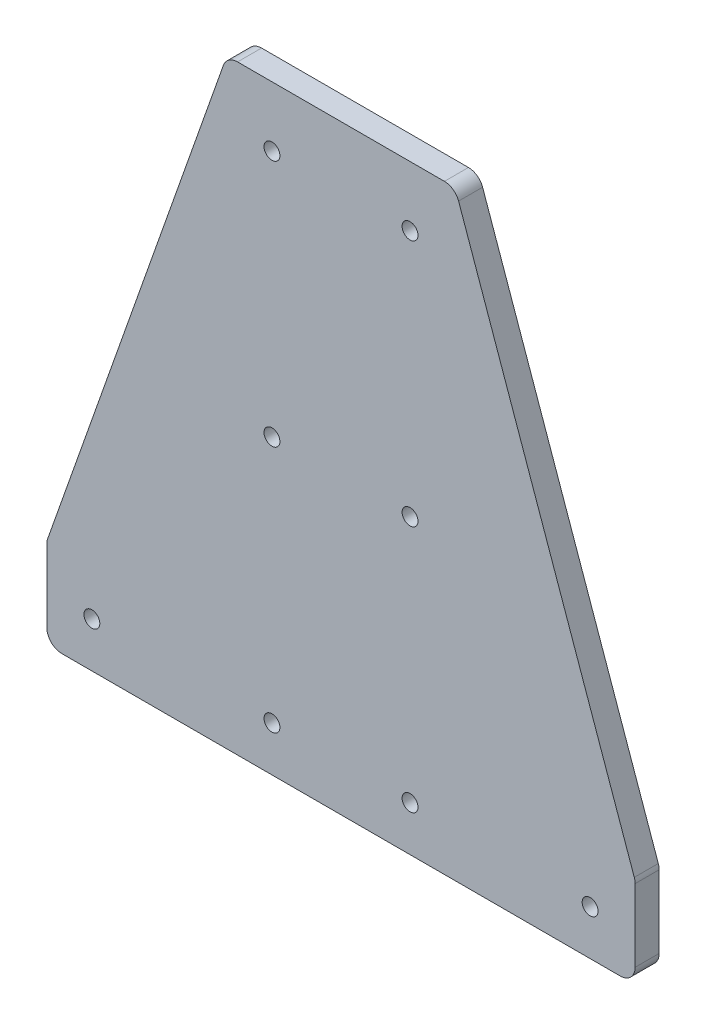
ISO-10303-21;
HEADER;
FILE_DESCRIPTION(('STEP AP214'),'2;1');
FILE_NAME('part.step','',(''),(''),'','','');
FILE_SCHEMA(('AUTOMOTIVE_DESIGN { 1 0 10303 214 1 1 1 1 }'));
ENDSEC;
DATA;
#1=APPLICATION_CONTEXT('core data for automotive mechanical design processes');
#2=APPLICATION_PROTOCOL_DEFINITION('international standard','automotive_design',2000,#1);
#3=PRODUCT_CONTEXT('',#1,'mechanical');
#4=PRODUCT('Part','Part','',(#3));
#5=PRODUCT_RELATED_PRODUCT_CATEGORY('part','',(#4));
#6=PRODUCT_DEFINITION_FORMATION('','',#4);
#7=PRODUCT_DEFINITION_CONTEXT('part definition',#1,'design');
#8=PRODUCT_DEFINITION('design','',#6,#7);
#9=PRODUCT_DEFINITION_SHAPE('','',#8);
#10=(LENGTH_UNIT() NAMED_UNIT(*) SI_UNIT(.MILLI.,.METRE.));
#11=(NAMED_UNIT(*) PLANE_ANGLE_UNIT() SI_UNIT($,.RADIAN.));
#12=(NAMED_UNIT(*) SI_UNIT($,.STERADIAN.) SOLID_ANGLE_UNIT());
#13=UNCERTAINTY_MEASURE_WITH_UNIT(LENGTH_MEASURE(1.E-05),#10,'distance_accuracy_value','');
#14=(GEOMETRIC_REPRESENTATION_CONTEXT(3) GLOBAL_UNCERTAINTY_ASSIGNED_CONTEXT((#13)) GLOBAL_UNIT_ASSIGNED_CONTEXT((#10,
#11,#12)) REPRESENTATION_CONTEXT('',''));
#15=CARTESIAN_POINT('',(0.,0.,0.));
#16=DIRECTION('',(0.,0.,1.));
#17=DIRECTION('',(1.,0.,0.));
#18=AXIS2_PLACEMENT_3D('',#15,#16,#17);
#19=CARTESIAN_POINT('',(-98.,0.,8.));
#20=DIRECTION('',(1.,0.,0.));
#21=DIRECTION('',(0.,0.,-1.));
#22=AXIS2_PLACEMENT_3D('',#19,#20,#21);
#23=PLANE('',#22);
#24=DIRECTION('',(0.,-1.,0.));
#25=VECTOR('',#24,1.);
#26=CARTESIAN_POINT('',(-98.,0.,0.));
#27=LINE('',#26,#25);
#28=CARTESIAN_POINT('',(-98.,-0.856463647766613,0.));
#29=VERTEX_POINT('',#28);
#30=CARTESIAN_POINT('',(-98.,-25.,0.));
#31=VERTEX_POINT('',#30);
#32=EDGE_CURVE('E200',#29,#31,#27,.T.);
#33=ORIENTED_EDGE('',*,*,#32,.T.);
#34=DIRECTION('',(0.,0.,-1.));
#35=VECTOR('',#34,1.);
#36=CARTESIAN_POINT('',(-98.,-25.,8.));
#37=LINE('',#36,#35);
#38=CARTESIAN_POINT('',(-98.,-25.,8.));
#39=VERTEX_POINT('',#38);
#40=EDGE_CURVE('E193',#31,#39,#37,.F.);
#41=ORIENTED_EDGE('',*,*,#40,.T.);
#42=DIRECTION('',(0.,-1.,0.));
#43=VECTOR('',#42,1.);
#44=CARTESIAN_POINT('',(-98.,0.,8.));
#45=LINE('',#44,#43);
#46=CARTESIAN_POINT('',(-98.,-0.856463647766613,8.));
#47=VERTEX_POINT('',#46);
#48=EDGE_CURVE('E150',#47,#39,#45,.T.);
#49=ORIENTED_EDGE('',*,*,#48,.F.);
#50=DIRECTION('',(0.,0.,-1.));
#51=VECTOR('',#50,1.);
#52=CARTESIAN_POINT('',(-98.,-0.856463647766613,8.));
#53=LINE('',#52,#51);
#54=EDGE_CURVE('E190',#47,#29,#53,.T.);
#55=ORIENTED_EDGE('',*,*,#54,.T.);
#56=EDGE_LOOP('',(#33,#41,#49,#55));
#57=FACE_BOUND('',#56,.T.);
#58=ADVANCED_FACE('F33',(#57),#23,.F.);
#59=CARTESIAN_POINT('',(-98.,-30.,8.));
#60=DIRECTION('',(0.,1.,0.));
#61=DIRECTION('',(0.,0.,1.));
#62=AXIS2_PLACEMENT_3D('',#59,#60,#61);
#63=PLANE('',#62);
#64=DIRECTION('',(1.,0.,0.));
#65=VECTOR('',#64,1.);
#66=CARTESIAN_POINT('',(-98.,-30.,0.));
#67=LINE('',#66,#65);
#68=CARTESIAN_POINT('',(-93.,-30.,0.));
#69=VERTEX_POINT('',#68);
#70=CARTESIAN_POINT('',(93.,-30.,0.));
#71=VERTEX_POINT('',#70);
#72=EDGE_CURVE('E227',#69,#71,#67,.T.);
#73=ORIENTED_EDGE('',*,*,#72,.T.);
#74=DIRECTION('',(0.,0.,-1.));
#75=VECTOR('',#74,1.);
#76=CARTESIAN_POINT('',(93.,-30.,8.));
#77=LINE('',#76,#75);
#78=CARTESIAN_POINT('',(93.,-30.,8.));
#79=VERTEX_POINT('',#78);
#80=EDGE_CURVE('E188',#71,#79,#77,.F.);
#81=ORIENTED_EDGE('',*,*,#80,.T.);
#82=DIRECTION('',(1.,0.,0.));
#83=VECTOR('',#82,1.);
#84=CARTESIAN_POINT('',(-98.,-30.,8.));
#85=LINE('',#84,#83);
#86=CARTESIAN_POINT('',(-93.,-30.,8.));
#87=VERTEX_POINT('',#86);
#88=EDGE_CURVE('E210',#87,#79,#85,.T.);
#89=ORIENTED_EDGE('',*,*,#88,.F.);
#90=DIRECTION('',(0.,0.,-1.));
#91=VECTOR('',#90,1.);
#92=CARTESIAN_POINT('',(-93.,-30.,8.));
#93=LINE('',#92,#91);
#94=EDGE_CURVE('E185',#87,#69,#93,.T.);
#95=ORIENTED_EDGE('',*,*,#94,.T.);
#96=EDGE_LOOP('',(#73,#81,#89,#95));
#97=FACE_BOUND('',#96,.T.);
#98=ADVANCED_FACE('F251',(#97),#63,.F.);
#99=CARTESIAN_POINT('',(98.,-30.,8.));
#100=DIRECTION('',(-1.,0.,0.));
#101=DIRECTION('',(0.,0.,1.));
#102=AXIS2_PLACEMENT_3D('',#99,#100,#101);
#103=PLANE('',#102);
#104=DIRECTION('',(0.,1.,0.));
#105=VECTOR('',#104,1.);
#106=CARTESIAN_POINT('',(98.,-30.,0.));
#107=LINE('',#106,#105);
#108=CARTESIAN_POINT('',(98.,-25.,0.));
#109=VERTEX_POINT('',#108);
#110=CARTESIAN_POINT('',(98.,-0.856463647766592,0.));
#111=VERTEX_POINT('',#110);
#112=EDGE_CURVE('E152',#109,#111,#107,.T.);
#113=ORIENTED_EDGE('',*,*,#112,.T.);
#114=DIRECTION('',(0.,0.,-1.));
#115=VECTOR('',#114,1.);
#116=CARTESIAN_POINT('',(98.,-0.856463647766592,8.));
#117=LINE('',#116,#115);
#118=CARTESIAN_POINT('',(98.,-0.856463647766592,8.));
#119=VERTEX_POINT('',#118);
#120=EDGE_CURVE('E183',#111,#119,#117,.F.);
#121=ORIENTED_EDGE('',*,*,#120,.T.);
#122=DIRECTION('',(0.,1.,0.));
#123=VECTOR('',#122,1.);
#124=CARTESIAN_POINT('',(98.,-30.,8.));
#125=LINE('',#124,#123);
#126=CARTESIAN_POINT('',(98.,-25.,8.));
#127=VERTEX_POINT('',#126);
#128=EDGE_CURVE('E213',#127,#119,#125,.T.);
#129=ORIENTED_EDGE('',*,*,#128,.F.);
#130=DIRECTION('',(0.,0.,-1.));
#131=VECTOR('',#130,1.);
#132=CARTESIAN_POINT('',(98.,-25.,8.));
#133=LINE('',#132,#131);
#134=EDGE_CURVE('E180',#127,#109,#133,.T.);
#135=ORIENTED_EDGE('',*,*,#134,.T.);
#136=EDGE_LOOP('',(#113,#121,#129,#135));
#137=FACE_BOUND('',#136,.T.);
#138=ADVANCED_FACE('F233',(#137),#103,.F.);
#139=CARTESIAN_POINT('',(98.,0.,8.));
#140=DIRECTION('',(-0.94299033358289,-0.332820117735137,0.));
#141=DIRECTION('',(0.332820117735137,-0.94299033358289,0.));
#142=AXIS2_PLACEMENT_3D('',#139,#140,#141);
#143=PLANE('',#142);
#144=DIRECTION('',(-0.332820117735137,0.94299033358289,0.));
#145=VECTOR('',#144,1.);
#146=CARTESIAN_POINT('',(98.,0.,0.));
#147=LINE('',#146,#145);
#148=CARTESIAN_POINT('',(97.7149516679144,0.807636940909095,0.));
#149=VERTEX_POINT('',#148);
#150=CARTESIAN_POINT('',(39.1773762628204,166.664100588676,0.));
#151=VERTEX_POINT('',#150);
#152=EDGE_CURVE('E148',#149,#151,#147,.T.);
#153=ORIENTED_EDGE('',*,*,#152,.T.);
#154=DIRECTION('',(0.,0.,-1.));
#155=VECTOR('',#154,1.);
#156=CARTESIAN_POINT('',(39.1773762628203,166.664100588676,8.));
#157=LINE('',#156,#155);
#158=CARTESIAN_POINT('',(39.1773762628204,166.664100588676,8.));
#159=VERTEX_POINT('',#158);
#160=EDGE_CURVE('E127',#151,#159,#157,.F.);
#161=ORIENTED_EDGE('',*,*,#160,.T.);
#162=DIRECTION('',(-0.332820117735137,0.94299033358289,0.));
#163=VECTOR('',#162,1.);
#164=CARTESIAN_POINT('',(98.,0.,8.));
#165=LINE('',#164,#163);
#166=CARTESIAN_POINT('',(97.7149516679144,0.807636940909095,8.));
#167=VERTEX_POINT('',#166);
#168=EDGE_CURVE('E221',#167,#159,#165,.T.);
#169=ORIENTED_EDGE('',*,*,#168,.F.);
#170=DIRECTION('',(0.,0.,-1.));
#171=VECTOR('',#170,1.);
#172=CARTESIAN_POINT('',(97.7149516679144,0.807636940909095,8.));
#173=LINE('',#172,#171);
#174=EDGE_CURVE('E132',#167,#149,#173,.T.);
#175=ORIENTED_EDGE('',*,*,#174,.T.);
#176=EDGE_LOOP('',(#153,#161,#169,#175));
#177=FACE_BOUND('',#176,.T.);
#178=ADVANCED_FACE('F243',(#177),#143,.F.);
#179=CARTESIAN_POINT('',(38.,170.,8.));
#180=DIRECTION('',(0.,-1.,0.));
#181=DIRECTION('',(0.,0.,-1.));
#182=AXIS2_PLACEMENT_3D('',#179,#180,#181);
#183=PLANE('',#182);
#184=DIRECTION('',(-1.,0.,0.));
#185=VECTOR('',#184,1.);
#186=CARTESIAN_POINT('',(38.,170.,8.));
#187=LINE('',#186,#185);
#188=CARTESIAN_POINT('',(34.4624245949059,170.,8.));
#189=VERTEX_POINT('',#188);
#190=CARTESIAN_POINT('',(-34.4624245949059,170.,8.));
#191=VERTEX_POINT('',#190);
#192=EDGE_CURVE('E141',#189,#191,#187,.T.);
#193=ORIENTED_EDGE('',*,*,#192,.F.);
#194=DIRECTION('',(0.,0.,-1.));
#195=VECTOR('',#194,1.);
#196=CARTESIAN_POINT('',(34.4624245949059,170.,8.));
#197=LINE('',#196,#195);
#198=CARTESIAN_POINT('',(34.4624245949059,170.,0.));
#199=VERTEX_POINT('',#198);
#200=EDGE_CURVE('E126',#189,#199,#197,.T.);
#201=ORIENTED_EDGE('',*,*,#200,.T.);
#202=DIRECTION('',(-1.,0.,0.));
#203=VECTOR('',#202,1.);
#204=CARTESIAN_POINT('',(38.,170.,0.));
#205=LINE('',#204,#203);
#206=CARTESIAN_POINT('',(-34.4624245949059,170.,0.));
#207=VERTEX_POINT('',#206);
#208=EDGE_CURVE('E139',#199,#207,#205,.T.);
#209=ORIENTED_EDGE('',*,*,#208,.T.);
#210=DIRECTION('',(0.,0.,-1.));
#211=VECTOR('',#210,1.);
#212=CARTESIAN_POINT('',(-34.4624245949059,170.,8.));
#213=LINE('',#212,#211);
#214=EDGE_CURVE('E143',#207,#191,#213,.F.);
#215=ORIENTED_EDGE('',*,*,#214,.T.);
#216=EDGE_LOOP('',(#193,#201,#209,#215));
#217=FACE_BOUND('',#216,.T.);
#218=ADVANCED_FACE('F138',(#217),#183,.F.);
#219=CARTESIAN_POINT('',(-38.,170.,8.));
#220=DIRECTION('',(0.94299033358289,-0.332820117735138,0.));
#221=DIRECTION('',(0.332820117735138,0.94299033358289,0.));
#222=AXIS2_PLACEMENT_3D('',#219,#220,#221);
#223=PLANE('',#222);
#224=DIRECTION('',(-0.332820117735138,-0.94299033358289,0.));
#225=VECTOR('',#224,1.);
#226=CARTESIAN_POINT('',(-38.,170.,0.));
#227=LINE('',#226,#225);
#228=CARTESIAN_POINT('',(-39.1773762628203,166.664100588676,0.));
#229=VERTEX_POINT('',#228);
#230=CARTESIAN_POINT('',(-97.7149516679144,0.807636940909046,0.));
#231=VERTEX_POINT('',#230);
#232=EDGE_CURVE('E147',#229,#231,#227,.T.);
#233=ORIENTED_EDGE('',*,*,#232,.T.);
#234=DIRECTION('',(0.,0.,-1.));
#235=VECTOR('',#234,1.);
#236=CARTESIAN_POINT('',(-97.7149516679144,0.807636940909046,8.));
#237=LINE('',#236,#235);
#238=CARTESIAN_POINT('',(-97.7149516679144,0.807636940909046,8.));
#239=VERTEX_POINT('',#238);
#240=EDGE_CURVE('E11',#231,#239,#237,.F.);
#241=ORIENTED_EDGE('',*,*,#240,.T.);
#242=DIRECTION('',(-0.332820117735138,-0.94299033358289,0.));
#243=VECTOR('',#242,1.);
#244=CARTESIAN_POINT('',(-38.,170.,8.));
#245=LINE('',#244,#243);
#246=CARTESIAN_POINT('',(-39.1773762628203,166.664100588676,8.));
#247=VERTEX_POINT('',#246);
#248=EDGE_CURVE('E156',#247,#239,#245,.T.);
#249=ORIENTED_EDGE('',*,*,#248,.F.);
#250=DIRECTION('',(0.,0.,-1.));
#251=VECTOR('',#250,1.);
#252=CARTESIAN_POINT('',(-39.1773762628203,166.664100588676,8.));
#253=LINE('',#252,#251);
#254=EDGE_CURVE('E41',#247,#229,#253,.T.);
#255=ORIENTED_EDGE('',*,*,#254,.T.);
#256=EDGE_LOOP('',(#233,#241,#249,#255));
#257=FACE_BOUND('',#256,.T.);
#258=ADVANCED_FACE('F196',(#257),#223,.F.);
#259=CARTESIAN_POINT('',(0.,0.,8.));
#260=DIRECTION('',(0.,0.,1.));
#261=DIRECTION('',(1.,0.,0.));
#262=AXIS2_PLACEMENT_3D('',#259,#260,#261);
#263=PLANE('',#262);
#264=CARTESIAN_POINT('',(-23.,150.,8.));
#265=DIRECTION('',(0.,0.,1.));
#266=DIRECTION('',(1.,0.,0.));
#267=AXIS2_PLACEMENT_3D('',#264,#265,#266);
#268=CIRCLE('',#267,2.65);
#269=CARTESIAN_POINT('',(-20.35,150.,8.));
#270=VERTEX_POINT('',#269);
#271=EDGE_CURVE('E489',#270,#270,#268,.T.);
#272=ORIENTED_EDGE('',*,*,#271,.F.);
#273=EDGE_LOOP('',(#272));
#274=FACE_BOUND('',#273,.T.);
#275=CARTESIAN_POINT('',(-23.,67.5,8.));
#276=DIRECTION('',(0.,0.,1.));
#277=DIRECTION('',(1.,0.,0.));
#278=AXIS2_PLACEMENT_3D('',#275,#276,#277);
#279=CIRCLE('',#278,2.65);
#280=CARTESIAN_POINT('',(-20.35,67.5,8.));
#281=VERTEX_POINT('',#280);
#282=EDGE_CURVE('E483',#281,#281,#279,.T.);
#283=ORIENTED_EDGE('',*,*,#282,.F.);
#284=EDGE_LOOP('',(#283));
#285=FACE_BOUND('',#284,.T.);
#286=CARTESIAN_POINT('',(-23.,-15.,8.));
#287=DIRECTION('',(0.,0.,1.));
#288=DIRECTION('',(1.,0.,0.));
#289=AXIS2_PLACEMENT_3D('',#286,#287,#288);
#290=CIRCLE('',#289,2.65);
#291=CARTESIAN_POINT('',(-20.35,-15.,8.));
#292=VERTEX_POINT('',#291);
#293=EDGE_CURVE('E477',#292,#292,#290,.T.);
#294=ORIENTED_EDGE('',*,*,#293,.F.);
#295=EDGE_LOOP('',(#294));
#296=FACE_BOUND('',#295,.T.);
#297=CARTESIAN_POINT('',(23.,-15.,8.));
#298=DIRECTION('',(0.,0.,1.));
#299=DIRECTION('',(1.,0.,0.));
#300=AXIS2_PLACEMENT_3D('',#297,#298,#299);
#301=CIRCLE('',#300,2.65);
#302=CARTESIAN_POINT('',(25.65,-15.,8.));
#303=VERTEX_POINT('',#302);
#304=EDGE_CURVE('E471',#303,#303,#301,.T.);
#305=ORIENTED_EDGE('',*,*,#304,.F.);
#306=EDGE_LOOP('',(#305));
#307=FACE_BOUND('',#306,.T.);
#308=CARTESIAN_POINT('',(23.,150.,8.));
#309=DIRECTION('',(0.,0.,1.));
#310=DIRECTION('',(1.,0.,0.));
#311=AXIS2_PLACEMENT_3D('',#308,#309,#310);
#312=CIRCLE('',#311,2.65);
#313=CARTESIAN_POINT('',(25.65,150.,8.));
#314=VERTEX_POINT('',#313);
#315=EDGE_CURVE('E465',#314,#314,#312,.T.);
#316=ORIENTED_EDGE('',*,*,#315,.F.);
#317=EDGE_LOOP('',(#316));
#318=FACE_BOUND('',#317,.T.);
#319=CARTESIAN_POINT('',(23.,67.5,8.));
#320=DIRECTION('',(0.,0.,1.));
#321=DIRECTION('',(1.,0.,0.));
#322=AXIS2_PLACEMENT_3D('',#319,#320,#321);
#323=CIRCLE('',#322,2.65);
#324=CARTESIAN_POINT('',(25.65,67.5,8.));
#325=VERTEX_POINT('',#324);
#326=EDGE_CURVE('E459',#325,#325,#323,.T.);
#327=ORIENTED_EDGE('',*,*,#326,.F.);
#328=EDGE_LOOP('',(#327));
#329=FACE_BOUND('',#328,.T.);
#330=CARTESIAN_POINT('',(-83.,-15.,8.));
#331=DIRECTION('',(0.,0.,1.));
#332=DIRECTION('',(1.,0.,0.));
#333=AXIS2_PLACEMENT_3D('',#330,#331,#332);
#334=CIRCLE('',#333,2.65);
#335=CARTESIAN_POINT('',(-80.35,-15.,8.));
#336=VERTEX_POINT('',#335);
#337=EDGE_CURVE('E451',#336,#336,#334,.T.);
#338=ORIENTED_EDGE('',*,*,#337,.F.);
#339=EDGE_LOOP('',(#338));
#340=FACE_BOUND('',#339,.T.);
#341=CARTESIAN_POINT('',(83.,-15.,8.));
#342=DIRECTION('',(0.,0.,1.));
#343=DIRECTION('',(1.,0.,0.));
#344=AXIS2_PLACEMENT_3D('',#341,#342,#343);
#345=CIRCLE('',#344,2.65);
#346=CARTESIAN_POINT('',(85.65,-15.,8.));
#347=VERTEX_POINT('',#346);
#348=EDGE_CURVE('E447',#347,#347,#345,.T.);
#349=ORIENTED_EDGE('',*,*,#348,.F.);
#350=EDGE_LOOP('',(#349));
#351=FACE_BOUND('',#350,.T.);
#352=ORIENTED_EDGE('',*,*,#168,.T.);
#353=CARTESIAN_POINT('',(34.4624245949059,165.,8.));
#354=DIRECTION('',(0.,0.,1.));
#355=DIRECTION('',(1.,0.,0.));
#356=AXIS2_PLACEMENT_3D('',#353,#354,#355);
#357=CIRCLE('',#356,5.);
#358=EDGE_CURVE('E178',#159,#189,#357,.T.);
#359=ORIENTED_EDGE('',*,*,#358,.T.);
#360=ORIENTED_EDGE('',*,*,#192,.T.);
#361=CARTESIAN_POINT('',(-34.4624245949059,165.,8.));
#362=DIRECTION('',(0.,0.,1.));
#363=DIRECTION('',(1.,0.,0.));
#364=AXIS2_PLACEMENT_3D('',#361,#362,#363);
#365=CIRCLE('',#364,5.);
#366=EDGE_CURVE('E53',#191,#247,#365,.T.);
#367=ORIENTED_EDGE('',*,*,#366,.T.);
#368=ORIENTED_EDGE('',*,*,#248,.T.);
#369=CARTESIAN_POINT('',(-93.,-0.856463647766613,8.));
#370=DIRECTION('',(0.,0.,1.));
#371=DIRECTION('',(1.,0.,0.));
#372=AXIS2_PLACEMENT_3D('',#369,#370,#371);
#373=CIRCLE('',#372,5.);
#374=EDGE_CURVE('E170',#239,#47,#373,.T.);
#375=ORIENTED_EDGE('',*,*,#374,.T.);
#376=ORIENTED_EDGE('',*,*,#48,.T.);
#377=CARTESIAN_POINT('',(-93.,-25.,8.));
#378=DIRECTION('',(0.,0.,1.));
#379=DIRECTION('',(1.,0.,0.));
#380=AXIS2_PLACEMENT_3D('',#377,#378,#379);
#381=CIRCLE('',#380,5.);
#382=EDGE_CURVE('E172',#39,#87,#381,.T.);
#383=ORIENTED_EDGE('',*,*,#382,.T.);
#384=ORIENTED_EDGE('',*,*,#88,.T.);
#385=CARTESIAN_POINT('',(93.,-25.,8.));
#386=DIRECTION('',(0.,0.,1.));
#387=DIRECTION('',(1.,0.,0.));
#388=AXIS2_PLACEMENT_3D('',#385,#386,#387);
#389=CIRCLE('',#388,5.);
#390=EDGE_CURVE('E174',#79,#127,#389,.T.);
#391=ORIENTED_EDGE('',*,*,#390,.T.);
#392=ORIENTED_EDGE('',*,*,#128,.T.);
#393=CARTESIAN_POINT('',(93.,-0.856463647766591,8.));
#394=DIRECTION('',(0.,0.,1.));
#395=DIRECTION('',(1.,0.,0.));
#396=AXIS2_PLACEMENT_3D('',#393,#394,#395);
#397=CIRCLE('',#396,5.);
#398=EDGE_CURVE('E176',#119,#167,#397,.T.);
#399=ORIENTED_EDGE('',*,*,#398,.T.);
#400=EDGE_LOOP('',(#352,#359,#360,#367,#368,#375,#376,#383,#384,#391,#392,#399));
#401=FACE_BOUND('',#400,.T.);
#402=ADVANCED_FACE('F241',(#274,#285,#296,#307,#318,#329,#340,#351,#401),#263,.T.);
#403=CARTESIAN_POINT('',(0.,0.,0.));
#404=DIRECTION('',(0.,0.,1.));
#405=DIRECTION('',(1.,0.,0.));
#406=AXIS2_PLACEMENT_3D('',#403,#404,#405);
#407=PLANE('',#406);
#408=CARTESIAN_POINT('',(-23.,150.,0.));
#409=DIRECTION('',(0.,0.,1.));
#410=DIRECTION('',(1.,0.,0.));
#411=AXIS2_PLACEMENT_3D('',#408,#409,#410);
#412=CIRCLE('',#411,2.65);
#413=CARTESIAN_POINT('',(-20.35,150.,0.));
#414=VERTEX_POINT('',#413);
#415=EDGE_CURVE('E486',#414,#414,#412,.T.);
#416=ORIENTED_EDGE('',*,*,#415,.T.);
#417=EDGE_LOOP('',(#416));
#418=FACE_BOUND('',#417,.T.);
#419=CARTESIAN_POINT('',(-23.,67.5,0.));
#420=DIRECTION('',(0.,0.,1.));
#421=DIRECTION('',(1.,0.,0.));
#422=AXIS2_PLACEMENT_3D('',#419,#420,#421);
#423=CIRCLE('',#422,2.65);
#424=CARTESIAN_POINT('',(-20.35,67.5,0.));
#425=VERTEX_POINT('',#424);
#426=EDGE_CURVE('E480',#425,#425,#423,.T.);
#427=ORIENTED_EDGE('',*,*,#426,.T.);
#428=EDGE_LOOP('',(#427));
#429=FACE_BOUND('',#428,.T.);
#430=CARTESIAN_POINT('',(-23.,-15.,0.));
#431=DIRECTION('',(0.,0.,1.));
#432=DIRECTION('',(1.,0.,0.));
#433=AXIS2_PLACEMENT_3D('',#430,#431,#432);
#434=CIRCLE('',#433,2.65);
#435=CARTESIAN_POINT('',(-20.35,-15.,0.));
#436=VERTEX_POINT('',#435);
#437=EDGE_CURVE('E474',#436,#436,#434,.T.);
#438=ORIENTED_EDGE('',*,*,#437,.T.);
#439=EDGE_LOOP('',(#438));
#440=FACE_BOUND('',#439,.T.);
#441=CARTESIAN_POINT('',(23.,-15.,0.));
#442=DIRECTION('',(0.,0.,1.));
#443=DIRECTION('',(1.,0.,0.));
#444=AXIS2_PLACEMENT_3D('',#441,#442,#443);
#445=CIRCLE('',#444,2.65);
#446=CARTESIAN_POINT('',(25.65,-15.,0.));
#447=VERTEX_POINT('',#446);
#448=EDGE_CURVE('E468',#447,#447,#445,.T.);
#449=ORIENTED_EDGE('',*,*,#448,.T.);
#450=EDGE_LOOP('',(#449));
#451=FACE_BOUND('',#450,.T.);
#452=CARTESIAN_POINT('',(23.,150.,0.));
#453=DIRECTION('',(0.,0.,1.));
#454=DIRECTION('',(1.,0.,0.));
#455=AXIS2_PLACEMENT_3D('',#452,#453,#454);
#456=CIRCLE('',#455,2.65);
#457=CARTESIAN_POINT('',(25.65,150.,0.));
#458=VERTEX_POINT('',#457);
#459=EDGE_CURVE('E462',#458,#458,#456,.T.);
#460=ORIENTED_EDGE('',*,*,#459,.T.);
#461=EDGE_LOOP('',(#460));
#462=FACE_BOUND('',#461,.T.);
#463=CARTESIAN_POINT('',(23.,67.5,0.));
#464=DIRECTION('',(0.,0.,1.));
#465=DIRECTION('',(1.,0.,0.));
#466=AXIS2_PLACEMENT_3D('',#463,#464,#465);
#467=CIRCLE('',#466,2.65);
#468=CARTESIAN_POINT('',(25.65,67.5,0.));
#469=VERTEX_POINT('',#468);
#470=EDGE_CURVE('E456',#469,#469,#467,.T.);
#471=ORIENTED_EDGE('',*,*,#470,.T.);
#472=EDGE_LOOP('',(#471));
#473=FACE_BOUND('',#472,.T.);
#474=CARTESIAN_POINT('',(-83.,-15.,0.));
#475=DIRECTION('',(0.,0.,1.));
#476=DIRECTION('',(1.,0.,0.));
#477=AXIS2_PLACEMENT_3D('',#474,#475,#476);
#478=CIRCLE('',#477,2.65);
#479=CARTESIAN_POINT('',(-80.35,-15.,0.));
#480=VERTEX_POINT('',#479);
#481=EDGE_CURVE('E449',#480,#480,#478,.T.);
#482=ORIENTED_EDGE('',*,*,#481,.T.);
#483=EDGE_LOOP('',(#482));
#484=FACE_BOUND('',#483,.T.);
#485=CARTESIAN_POINT('',(83.,-15.,0.));
#486=DIRECTION('',(0.,0.,1.));
#487=DIRECTION('',(1.,0.,0.));
#488=AXIS2_PLACEMENT_3D('',#485,#486,#487);
#489=CIRCLE('',#488,2.65);
#490=CARTESIAN_POINT('',(85.65,-15.,0.));
#491=VERTEX_POINT('',#490);
#492=EDGE_CURVE('E216',#491,#491,#489,.T.);
#493=ORIENTED_EDGE('',*,*,#492,.T.);
#494=EDGE_LOOP('',(#493));
#495=FACE_BOUND('',#494,.T.);
#496=ORIENTED_EDGE('',*,*,#208,.F.);
#497=CARTESIAN_POINT('',(34.4624245949059,165.,0.));
#498=DIRECTION('',(0.,0.,1.));
#499=DIRECTION('',(1.,0.,0.));
#500=AXIS2_PLACEMENT_3D('',#497,#498,#499);
#501=CIRCLE('',#500,5.);
#502=EDGE_CURVE('E122',#199,#151,#501,.F.);
#503=ORIENTED_EDGE('',*,*,#502,.T.);
#504=ORIENTED_EDGE('',*,*,#152,.F.);
#505=CARTESIAN_POINT('',(93.,-0.856463647766591,0.));
#506=DIRECTION('',(0.,0.,1.));
#507=DIRECTION('',(1.,0.,0.));
#508=AXIS2_PLACEMENT_3D('',#505,#506,#507);
#509=CIRCLE('',#508,5.);
#510=EDGE_CURVE('E133',#149,#111,#509,.F.);
#511=ORIENTED_EDGE('',*,*,#510,.T.);
#512=ORIENTED_EDGE('',*,*,#112,.F.);
#513=CARTESIAN_POINT('',(93.,-25.,0.));
#514=DIRECTION('',(0.,0.,1.));
#515=DIRECTION('',(1.,0.,0.));
#516=AXIS2_PLACEMENT_3D('',#513,#514,#515);
#517=CIRCLE('',#516,5.);
#518=EDGE_CURVE('E163',#109,#71,#517,.F.);
#519=ORIENTED_EDGE('',*,*,#518,.T.);
#520=ORIENTED_EDGE('',*,*,#72,.F.);
#521=CARTESIAN_POINT('',(-93.,-25.,0.));
#522=DIRECTION('',(0.,0.,1.));
#523=DIRECTION('',(1.,0.,0.));
#524=AXIS2_PLACEMENT_3D('',#521,#522,#523);
#525=CIRCLE('',#524,5.);
#526=EDGE_CURVE('E161',#69,#31,#525,.F.);
#527=ORIENTED_EDGE('',*,*,#526,.T.);
#528=ORIENTED_EDGE('',*,*,#32,.F.);
#529=CARTESIAN_POINT('',(-93.,-0.856463647766613,0.));
#530=DIRECTION('',(0.,0.,1.));
#531=DIRECTION('',(1.,0.,0.));
#532=AXIS2_PLACEMENT_3D('',#529,#530,#531);
#533=CIRCLE('',#532,5.);
#534=EDGE_CURVE('E159',#29,#231,#533,.F.);
#535=ORIENTED_EDGE('',*,*,#534,.T.);
#536=ORIENTED_EDGE('',*,*,#232,.F.);
#537=CARTESIAN_POINT('',(-34.4624245949059,165.,0.));
#538=DIRECTION('',(0.,0.,1.));
#539=DIRECTION('',(1.,0.,0.));
#540=AXIS2_PLACEMENT_3D('',#537,#538,#539);
#541=CIRCLE('',#540,5.);
#542=EDGE_CURVE('E142',#229,#207,#541,.F.);
#543=ORIENTED_EDGE('',*,*,#542,.T.);
#544=EDGE_LOOP('',(#496,#503,#504,#511,#512,#519,#520,#527,#528,#535,#536,#543));
#545=FACE_BOUND('',#544,.T.);
#546=ADVANCED_FACE('F145',(#418,#429,#440,#451,#462,#473,#484,#495,#545),#407,.F.);
#547=CARTESIAN_POINT('',(83.,-15.,8.));
#548=DIRECTION('',(0.,0.,1.));
#549=DIRECTION('',(1.,0.,0.));
#550=AXIS2_PLACEMENT_3D('',#547,#548,#549);
#551=CYLINDRICAL_SURFACE('',#550,2.65);
#552=ORIENTED_EDGE('',*,*,#492,.F.);
#553=EDGE_LOOP('',(#552));
#554=FACE_BOUND('',#553,.T.);
#555=ORIENTED_EDGE('',*,*,#348,.T.);
#556=EDGE_LOOP('',(#555));
#557=FACE_BOUND('',#556,.T.);
#558=ADVANCED_FACE('F318',(#554,#557),#551,.F.);
#559=CARTESIAN_POINT('',(-83.,-15.,8.));
#560=DIRECTION('',(0.,0.,1.));
#561=DIRECTION('',(1.,0.,0.));
#562=AXIS2_PLACEMENT_3D('',#559,#560,#561);
#563=CYLINDRICAL_SURFACE('',#562,2.65);
#564=ORIENTED_EDGE('',*,*,#481,.F.);
#565=EDGE_LOOP('',(#564));
#566=FACE_BOUND('',#565,.T.);
#567=ORIENTED_EDGE('',*,*,#337,.T.);
#568=EDGE_LOOP('',(#567));
#569=FACE_BOUND('',#568,.T.);
#570=ADVANCED_FACE('F421',(#566,#569),#563,.F.);
#571=CARTESIAN_POINT('',(23.,67.5,8.));
#572=DIRECTION('',(0.,0.,1.));
#573=DIRECTION('',(1.,0.,0.));
#574=AXIS2_PLACEMENT_3D('',#571,#572,#573);
#575=CYLINDRICAL_SURFACE('',#574,2.65);
#576=ORIENTED_EDGE('',*,*,#470,.F.);
#577=EDGE_LOOP('',(#576));
#578=FACE_BOUND('',#577,.T.);
#579=ORIENTED_EDGE('',*,*,#326,.T.);
#580=EDGE_LOOP('',(#579));
#581=FACE_BOUND('',#580,.T.);
#582=ADVANCED_FACE('F411',(#578,#581),#575,.F.);
#583=CARTESIAN_POINT('',(23.,150.,8.));
#584=DIRECTION('',(0.,0.,1.));
#585=DIRECTION('',(1.,0.,0.));
#586=AXIS2_PLACEMENT_3D('',#583,#584,#585);
#587=CYLINDRICAL_SURFACE('',#586,2.65);
#588=ORIENTED_EDGE('',*,*,#459,.F.);
#589=EDGE_LOOP('',(#588));
#590=FACE_BOUND('',#589,.T.);
#591=ORIENTED_EDGE('',*,*,#315,.T.);
#592=EDGE_LOOP('',(#591));
#593=FACE_BOUND('',#592,.T.);
#594=ADVANCED_FACE('F401',(#590,#593),#587,.F.);
#595=CARTESIAN_POINT('',(23.,-15.,8.));
#596=DIRECTION('',(0.,0.,1.));
#597=DIRECTION('',(1.,0.,0.));
#598=AXIS2_PLACEMENT_3D('',#595,#596,#597);
#599=CYLINDRICAL_SURFACE('',#598,2.65);
#600=ORIENTED_EDGE('',*,*,#448,.F.);
#601=EDGE_LOOP('',(#600));
#602=FACE_BOUND('',#601,.T.);
#603=ORIENTED_EDGE('',*,*,#304,.T.);
#604=EDGE_LOOP('',(#603));
#605=FACE_BOUND('',#604,.T.);
#606=ADVANCED_FACE('F391',(#602,#605),#599,.F.);
#607=CARTESIAN_POINT('',(-23.,-15.,8.));
#608=DIRECTION('',(0.,0.,1.));
#609=DIRECTION('',(1.,0.,0.));
#610=AXIS2_PLACEMENT_3D('',#607,#608,#609);
#611=CYLINDRICAL_SURFACE('',#610,2.65);
#612=ORIENTED_EDGE('',*,*,#437,.F.);
#613=EDGE_LOOP('',(#612));
#614=FACE_BOUND('',#613,.T.);
#615=ORIENTED_EDGE('',*,*,#293,.T.);
#616=EDGE_LOOP('',(#615));
#617=FACE_BOUND('',#616,.T.);
#618=ADVANCED_FACE('F381',(#614,#617),#611,.F.);
#619=CARTESIAN_POINT('',(-23.,67.5,8.));
#620=DIRECTION('',(0.,0.,1.));
#621=DIRECTION('',(1.,0.,0.));
#622=AXIS2_PLACEMENT_3D('',#619,#620,#621);
#623=CYLINDRICAL_SURFACE('',#622,2.65);
#624=ORIENTED_EDGE('',*,*,#426,.F.);
#625=EDGE_LOOP('',(#624));
#626=FACE_BOUND('',#625,.T.);
#627=ORIENTED_EDGE('',*,*,#282,.T.);
#628=EDGE_LOOP('',(#627));
#629=FACE_BOUND('',#628,.T.);
#630=ADVANCED_FACE('F371',(#626,#629),#623,.F.);
#631=CARTESIAN_POINT('',(-23.,150.,8.));
#632=DIRECTION('',(0.,0.,1.));
#633=DIRECTION('',(1.,0.,0.));
#634=AXIS2_PLACEMENT_3D('',#631,#632,#633);
#635=CYLINDRICAL_SURFACE('',#634,2.65);
#636=ORIENTED_EDGE('',*,*,#415,.F.);
#637=EDGE_LOOP('',(#636));
#638=FACE_BOUND('',#637,.T.);
#639=ORIENTED_EDGE('',*,*,#271,.T.);
#640=EDGE_LOOP('',(#639));
#641=FACE_BOUND('',#640,.T.);
#642=ADVANCED_FACE('F263',(#638,#641),#635,.F.);
#643=CARTESIAN_POINT('',(34.4624245949059,165.,8.));
#644=DIRECTION('',(0.,0.,-1.));
#645=DIRECTION('',(-1.,0.,0.));
#646=AXIS2_PLACEMENT_3D('',#643,#644,#645);
#647=CYLINDRICAL_SURFACE('',#646,5.);
#648=ORIENTED_EDGE('',*,*,#358,.F.);
#649=ORIENTED_EDGE('',*,*,#160,.F.);
#650=ORIENTED_EDGE('',*,*,#502,.F.);
#651=ORIENTED_EDGE('',*,*,#200,.F.);
#652=EDGE_LOOP('',(#648,#649,#650,#651));
#653=FACE_BOUND('',#652,.T.);
#654=ADVANCED_FACE('F125',(#653),#647,.T.);
#655=CARTESIAN_POINT('',(93.,-0.856463647766591,8.));
#656=DIRECTION('',(0.,0.,-1.));
#657=DIRECTION('',(-1.,0.,0.));
#658=AXIS2_PLACEMENT_3D('',#655,#656,#657);
#659=CYLINDRICAL_SURFACE('',#658,5.);
#660=ORIENTED_EDGE('',*,*,#398,.F.);
#661=ORIENTED_EDGE('',*,*,#120,.F.);
#662=ORIENTED_EDGE('',*,*,#510,.F.);
#663=ORIENTED_EDGE('',*,*,#174,.F.);
#664=EDGE_LOOP('',(#660,#661,#662,#663));
#665=FACE_BOUND('',#664,.T.);
#666=ADVANCED_FACE('F238',(#665),#659,.T.);
#667=CARTESIAN_POINT('',(93.,-25.,8.));
#668=DIRECTION('',(0.,0.,-1.));
#669=DIRECTION('',(-1.,0.,0.));
#670=AXIS2_PLACEMENT_3D('',#667,#668,#669);
#671=CYLINDRICAL_SURFACE('',#670,5.);
#672=ORIENTED_EDGE('',*,*,#390,.F.);
#673=ORIENTED_EDGE('',*,*,#80,.F.);
#674=ORIENTED_EDGE('',*,*,#518,.F.);
#675=ORIENTED_EDGE('',*,*,#134,.F.);
#676=EDGE_LOOP('',(#672,#673,#674,#675));
#677=FACE_BOUND('',#676,.T.);
#678=ADVANCED_FACE('F266',(#677),#671,.T.);
#679=CARTESIAN_POINT('',(-93.,-25.,8.));
#680=DIRECTION('',(0.,0.,-1.));
#681=DIRECTION('',(-1.,0.,0.));
#682=AXIS2_PLACEMENT_3D('',#679,#680,#681);
#683=CYLINDRICAL_SURFACE('',#682,5.);
#684=ORIENTED_EDGE('',*,*,#382,.F.);
#685=ORIENTED_EDGE('',*,*,#40,.F.);
#686=ORIENTED_EDGE('',*,*,#526,.F.);
#687=ORIENTED_EDGE('',*,*,#94,.F.);
#688=EDGE_LOOP('',(#684,#685,#686,#687));
#689=FACE_BOUND('',#688,.T.);
#690=ADVANCED_FACE('F269',(#689),#683,.T.);
#691=CARTESIAN_POINT('',(-93.,-0.856463647766613,8.));
#692=DIRECTION('',(0.,0.,-1.));
#693=DIRECTION('',(-1.,0.,0.));
#694=AXIS2_PLACEMENT_3D('',#691,#692,#693);
#695=CYLINDRICAL_SURFACE('',#694,5.);
#696=ORIENTED_EDGE('',*,*,#374,.F.);
#697=ORIENTED_EDGE('',*,*,#240,.F.);
#698=ORIENTED_EDGE('',*,*,#534,.F.);
#699=ORIENTED_EDGE('',*,*,#54,.F.);
#700=EDGE_LOOP('',(#696,#697,#698,#699));
#701=FACE_BOUND('',#700,.T.);
#702=ADVANCED_FACE('F204',(#701),#695,.T.);
#703=CARTESIAN_POINT('',(-34.4624245949059,165.,8.));
#704=DIRECTION('',(0.,0.,-1.));
#705=DIRECTION('',(-1.,0.,0.));
#706=AXIS2_PLACEMENT_3D('',#703,#704,#705);
#707=CYLINDRICAL_SURFACE('',#706,5.);
#708=ORIENTED_EDGE('',*,*,#366,.F.);
#709=ORIENTED_EDGE('',*,*,#214,.F.);
#710=ORIENTED_EDGE('',*,*,#542,.F.);
#711=ORIENTED_EDGE('',*,*,#254,.F.);
#712=EDGE_LOOP('',(#708,#709,#710,#711));
#713=FACE_BOUND('',#712,.T.);
#714=ADVANCED_FACE('F35',(#713),#707,.T.);
#715=CLOSED_SHELL('',(#58,#98,#138,#178,#218,#258,#402,#546,#558,#570,#582,#594,#606,#618,#630,
#642,#654,#666,#678,#690,#702,#714));
#716=MANIFOLD_SOLID_BREP('B2',#715);
#717=ADVANCED_BREP_SHAPE_REPRESENTATION('',(#18,#716),#14);
#718=SHAPE_DEFINITION_REPRESENTATION(#9,#717);
ENDSEC;
END-ISO-10303-21;
